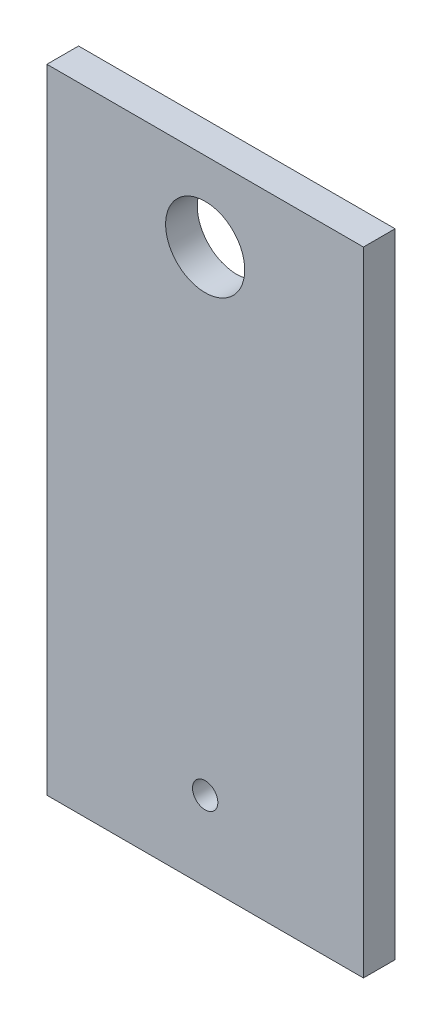
ISO-10303-21;
HEADER;
FILE_DESCRIPTION(('STEP AP214'),'2;1');
FILE_NAME('part.step','',(''),(''),'','','');
FILE_SCHEMA(('AUTOMOTIVE_DESIGN { 1 0 10303 214 1 1 1 1 }'));
ENDSEC;
DATA;
#1=APPLICATION_CONTEXT('core data for automotive mechanical design processes');
#2=APPLICATION_PROTOCOL_DEFINITION('international standard','automotive_design',2000,#1);
#3=PRODUCT_CONTEXT('',#1,'mechanical');
#4=PRODUCT('Part','Part','',(#3));
#5=PRODUCT_RELATED_PRODUCT_CATEGORY('part','',(#4));
#6=PRODUCT_DEFINITION_FORMATION('','',#4);
#7=PRODUCT_DEFINITION_CONTEXT('part definition',#1,'design');
#8=PRODUCT_DEFINITION('design','',#6,#7);
#9=PRODUCT_DEFINITION_SHAPE('','',#8);
#10=(LENGTH_UNIT() NAMED_UNIT(*) SI_UNIT(.MILLI.,.METRE.));
#11=(NAMED_UNIT(*) PLANE_ANGLE_UNIT() SI_UNIT($,.RADIAN.));
#12=(NAMED_UNIT(*) SI_UNIT($,.STERADIAN.) SOLID_ANGLE_UNIT());
#13=UNCERTAINTY_MEASURE_WITH_UNIT(LENGTH_MEASURE(1.E-05),#10,'distance_accuracy_value','');
#14=(GEOMETRIC_REPRESENTATION_CONTEXT(3) GLOBAL_UNCERTAINTY_ASSIGNED_CONTEXT((#13)) GLOBAL_UNIT_ASSIGNED_CONTEXT((#10,
#11,#12)) REPRESENTATION_CONTEXT('',''));
#15=CARTESIAN_POINT('',(0.,0.,0.));
#16=DIRECTION('',(0.,0.,1.));
#17=DIRECTION('',(1.,0.,0.));
#18=AXIS2_PLACEMENT_3D('',#15,#16,#17);
#19=CARTESIAN_POINT('',(50.,100.,10.));
#20=DIRECTION('',(-1.,0.,0.));
#21=DIRECTION('',(0.,-1.,0.));
#22=AXIS2_PLACEMENT_3D('',#19,#20,#21);
#23=PLANE('',#22);
#24=DIRECTION('',(0.,1.,0.));
#25=VECTOR('',#24,1.);
#26=CARTESIAN_POINT('',(50.,100.,0.));
#27=LINE('',#26,#25);
#28=CARTESIAN_POINT('',(50.,-100.,0.));
#29=VERTEX_POINT('',#28);
#30=CARTESIAN_POINT('',(50.,100.,0.));
#31=VERTEX_POINT('',#30);
#32=EDGE_CURVE('E96',#29,#31,#27,.T.);
#33=ORIENTED_EDGE('',*,*,#32,.T.);
#34=DIRECTION('',(0.,0.,-1.));
#35=VECTOR('',#34,1.);
#36=CARTESIAN_POINT('',(50.,100.,10.));
#37=LINE('',#36,#35);
#38=CARTESIAN_POINT('',(50.,100.,10.));
#39=VERTEX_POINT('',#38);
#40=EDGE_CURVE('E11',#39,#31,#37,.T.);
#41=ORIENTED_EDGE('',*,*,#40,.F.);
#42=DIRECTION('',(0.,1.,0.));
#43=VECTOR('',#42,1.);
#44=CARTESIAN_POINT('',(50.,100.,10.));
#45=LINE('',#44,#43);
#46=CARTESIAN_POINT('',(50.,-100.,10.));
#47=VERTEX_POINT('',#46);
#48=EDGE_CURVE('E84',#47,#39,#45,.T.);
#49=ORIENTED_EDGE('',*,*,#48,.F.);
#50=DIRECTION('',(0.,0.,-1.));
#51=VECTOR('',#50,1.);
#52=CARTESIAN_POINT('',(50.,-100.,10.));
#53=LINE('',#52,#51);
#54=EDGE_CURVE('E92',#47,#29,#53,.T.);
#55=ORIENTED_EDGE('',*,*,#54,.T.);
#56=EDGE_LOOP('',(#33,#41,#49,#55));
#57=FACE_BOUND('',#56,.T.);
#58=ADVANCED_FACE('F33',(#57),#23,.F.);
#59=CARTESIAN_POINT('',(-50.,100.,10.));
#60=DIRECTION('',(0.,-1.,0.));
#61=DIRECTION('',(0.,0.,-1.));
#62=AXIS2_PLACEMENT_3D('',#59,#60,#61);
#63=PLANE('',#62);
#64=DIRECTION('',(-1.,0.,0.));
#65=VECTOR('',#64,1.);
#66=CARTESIAN_POINT('',(-50.,100.,0.));
#67=LINE('',#66,#65);
#68=CARTESIAN_POINT('',(-50.,100.,0.));
#69=VERTEX_POINT('',#68);
#70=EDGE_CURVE('E88',#31,#69,#67,.T.);
#71=ORIENTED_EDGE('',*,*,#70,.T.);
#72=DIRECTION('',(0.,0.,-1.));
#73=VECTOR('',#72,1.);
#74=CARTESIAN_POINT('',(-50.,100.,10.));
#75=LINE('',#74,#73);
#76=CARTESIAN_POINT('',(-50.,100.,10.));
#77=VERTEX_POINT('',#76);
#78=EDGE_CURVE('E41',#77,#69,#75,.T.);
#79=ORIENTED_EDGE('',*,*,#78,.F.);
#80=DIRECTION('',(-1.,0.,0.));
#81=VECTOR('',#80,1.);
#82=CARTESIAN_POINT('',(-50.,100.,10.));
#83=LINE('',#82,#81);
#84=EDGE_CURVE('E79',#39,#77,#83,.T.);
#85=ORIENTED_EDGE('',*,*,#84,.F.);
#86=ORIENTED_EDGE('',*,*,#40,.T.);
#87=EDGE_LOOP('',(#71,#79,#85,#86));
#88=FACE_BOUND('',#87,.T.);
#89=ADVANCED_FACE('F87',(#88),#63,.F.);
#90=CARTESIAN_POINT('',(-50.,100.,10.));
#91=DIRECTION('',(1.,0.,0.));
#92=DIRECTION('',(0.,1.,0.));
#93=AXIS2_PLACEMENT_3D('',#90,#91,#92);
#94=PLANE('',#93);
#95=DIRECTION('',(0.,-1.,0.));
#96=VECTOR('',#95,1.);
#97=CARTESIAN_POINT('',(-50.,100.,0.));
#98=LINE('',#97,#96);
#99=CARTESIAN_POINT('',(-50.,-100.,0.));
#100=VERTEX_POINT('',#99);
#101=EDGE_CURVE('E66',#69,#100,#98,.T.);
#102=ORIENTED_EDGE('',*,*,#101,.T.);
#103=DIRECTION('',(0.,0.,-1.));
#104=VECTOR('',#103,1.);
#105=CARTESIAN_POINT('',(-50.,-100.,10.));
#106=LINE('',#105,#104);
#107=CARTESIAN_POINT('',(-50.,-100.,10.));
#108=VERTEX_POINT('',#107);
#109=EDGE_CURVE('E89',#108,#100,#106,.T.);
#110=ORIENTED_EDGE('',*,*,#109,.F.);
#111=DIRECTION('',(0.,-1.,0.));
#112=VECTOR('',#111,1.);
#113=CARTESIAN_POINT('',(-50.,100.,10.));
#114=LINE('',#113,#112);
#115=EDGE_CURVE('E82',#77,#108,#114,.T.);
#116=ORIENTED_EDGE('',*,*,#115,.F.);
#117=ORIENTED_EDGE('',*,*,#78,.T.);
#118=EDGE_LOOP('',(#102,#110,#116,#117));
#119=FACE_BOUND('',#118,.T.);
#120=ADVANCED_FACE('F90',(#119),#94,.F.);
#121=CARTESIAN_POINT('',(-50.,-100.,10.));
#122=DIRECTION('',(0.,1.,0.));
#123=DIRECTION('',(0.,0.,1.));
#124=AXIS2_PLACEMENT_3D('',#121,#122,#123);
#125=PLANE('',#124);
#126=DIRECTION('',(1.,0.,0.));
#127=VECTOR('',#126,1.);
#128=CARTESIAN_POINT('',(-50.,-100.,0.));
#129=LINE('',#128,#127);
#130=EDGE_CURVE('E72',#100,#29,#129,.T.);
#131=ORIENTED_EDGE('',*,*,#130,.T.);
#132=ORIENTED_EDGE('',*,*,#54,.F.);
#133=DIRECTION('',(1.,0.,0.));
#134=VECTOR('',#133,1.);
#135=CARTESIAN_POINT('',(-50.,-100.,10.));
#136=LINE('',#135,#134);
#137=EDGE_CURVE('E49',#108,#47,#136,.T.);
#138=ORIENTED_EDGE('',*,*,#137,.F.);
#139=ORIENTED_EDGE('',*,*,#109,.T.);
#140=EDGE_LOOP('',(#131,#132,#138,#139));
#141=FACE_BOUND('',#140,.T.);
#142=ADVANCED_FACE('F104',(#141),#125,.F.);
#143=CARTESIAN_POINT('',(0.,0.,10.));
#144=DIRECTION('',(0.,0.,1.));
#145=DIRECTION('',(1.,0.,0.));
#146=AXIS2_PLACEMENT_3D('',#143,#144,#145);
#147=PLANE('',#146);
#148=CARTESIAN_POINT('',(0.,75.,10.));
#149=DIRECTION('',(0.,0.,1.));
#150=DIRECTION('',(1.,0.,0.));
#151=AXIS2_PLACEMENT_3D('',#148,#149,#150);
#152=CIRCLE('',#151,12.5);
#153=CARTESIAN_POINT('',(12.5,75.,10.));
#154=VERTEX_POINT('',#153);
#155=EDGE_CURVE('E116',#154,#154,#152,.T.);
#156=ORIENTED_EDGE('',*,*,#155,.F.);
#157=EDGE_LOOP('',(#156));
#158=FACE_BOUND('',#157,.T.);
#159=CARTESIAN_POINT('',(0.,-75.,10.));
#160=DIRECTION('',(0.,0.,1.));
#161=DIRECTION('',(1.,0.,0.));
#162=AXIS2_PLACEMENT_3D('',#159,#160,#161);
#163=CIRCLE('',#162,4.);
#164=CARTESIAN_POINT('',(4.,-75.,10.));
#165=VERTEX_POINT('',#164);
#166=EDGE_CURVE('E110',#165,#165,#163,.T.);
#167=ORIENTED_EDGE('',*,*,#166,.F.);
#168=EDGE_LOOP('',(#167));
#169=FACE_BOUND('',#168,.T.);
#170=ORIENTED_EDGE('',*,*,#48,.T.);
#171=ORIENTED_EDGE('',*,*,#84,.T.);
#172=ORIENTED_EDGE('',*,*,#115,.T.);
#173=ORIENTED_EDGE('',*,*,#137,.T.);
#174=EDGE_LOOP('',(#170,#171,#172,#173));
#175=FACE_BOUND('',#174,.T.);
#176=ADVANCED_FACE('F80',(#158,#169,#175),#147,.T.);
#177=CARTESIAN_POINT('',(0.,0.,0.));
#178=DIRECTION('',(0.,0.,1.));
#179=DIRECTION('',(1.,0.,0.));
#180=AXIS2_PLACEMENT_3D('',#177,#178,#179);
#181=PLANE('',#180);
#182=CARTESIAN_POINT('',(0.,75.,0.));
#183=DIRECTION('',(0.,0.,1.));
#184=DIRECTION('',(1.,0.,0.));
#185=AXIS2_PLACEMENT_3D('',#182,#183,#184);
#186=CIRCLE('',#185,12.5);
#187=CARTESIAN_POINT('',(12.5,75.,0.));
#188=VERTEX_POINT('',#187);
#189=EDGE_CURVE('E113',#188,#188,#186,.T.);
#190=ORIENTED_EDGE('',*,*,#189,.T.);
#191=EDGE_LOOP('',(#190));
#192=FACE_BOUND('',#191,.T.);
#193=CARTESIAN_POINT('',(0.,-75.,0.));
#194=DIRECTION('',(0.,0.,1.));
#195=DIRECTION('',(1.,0.,0.));
#196=AXIS2_PLACEMENT_3D('',#193,#194,#195);
#197=CIRCLE('',#196,4.);
#198=CARTESIAN_POINT('',(4.,-75.,0.));
#199=VERTEX_POINT('',#198);
#200=EDGE_CURVE('E99',#199,#199,#197,.T.);
#201=ORIENTED_EDGE('',*,*,#200,.T.);
#202=EDGE_LOOP('',(#201));
#203=FACE_BOUND('',#202,.T.);
#204=ORIENTED_EDGE('',*,*,#32,.F.);
#205=ORIENTED_EDGE('',*,*,#130,.F.);
#206=ORIENTED_EDGE('',*,*,#101,.F.);
#207=ORIENTED_EDGE('',*,*,#70,.F.);
#208=EDGE_LOOP('',(#204,#205,#206,#207));
#209=FACE_BOUND('',#208,.T.);
#210=ADVANCED_FACE('F107',(#192,#203,#209),#181,.F.);
#211=CARTESIAN_POINT('',(0.,-75.,0.));
#212=DIRECTION('',(0.,0.,1.));
#213=DIRECTION('',(1.,0.,0.));
#214=AXIS2_PLACEMENT_3D('',#211,#212,#213);
#215=CYLINDRICAL_SURFACE('',#214,4.);
#216=ORIENTED_EDGE('',*,*,#200,.F.);
#217=EDGE_LOOP('',(#216));
#218=FACE_BOUND('',#217,.T.);
#219=ORIENTED_EDGE('',*,*,#166,.T.);
#220=EDGE_LOOP('',(#219));
#221=FACE_BOUND('',#220,.T.);
#222=ADVANCED_FACE('F127',(#218,#221),#215,.F.);
#223=CARTESIAN_POINT('',(0.,75.,0.));
#224=DIRECTION('',(0.,0.,1.));
#225=DIRECTION('',(1.,0.,0.));
#226=AXIS2_PLACEMENT_3D('',#223,#224,#225);
#227=CYLINDRICAL_SURFACE('',#226,12.5);
#228=ORIENTED_EDGE('',*,*,#189,.F.);
#229=EDGE_LOOP('',(#228));
#230=FACE_BOUND('',#229,.T.);
#231=ORIENTED_EDGE('',*,*,#155,.T.);
#232=EDGE_LOOP('',(#231));
#233=FACE_BOUND('',#232,.T.);
#234=ADVANCED_FACE('F124',(#230,#233),#227,.F.);
#235=CLOSED_SHELL('',(#58,#89,#120,#142,#176,#210,#222,#234));
#236=MANIFOLD_SOLID_BREP('B2',#235);
#237=ADVANCED_BREP_SHAPE_REPRESENTATION('',(#18,#236),#14);
#238=SHAPE_DEFINITION_REPRESENTATION(#9,#237);
ENDSEC;
END-ISO-10303-21;
